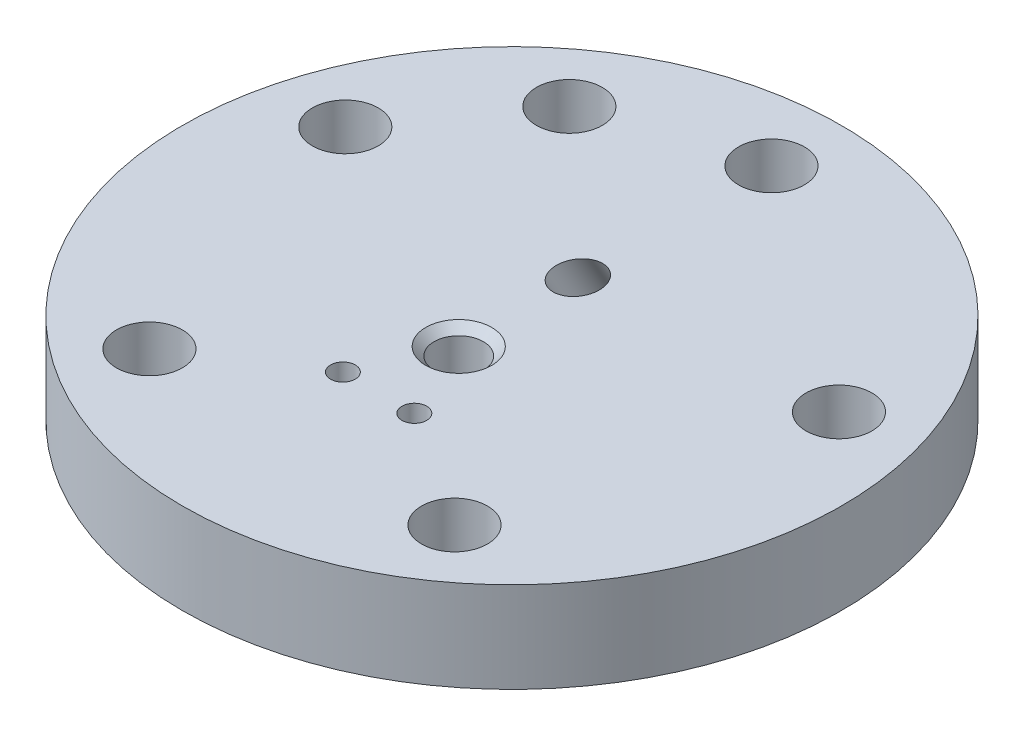
ISO-10303-21;
HEADER;
FILE_DESCRIPTION(('STEP AP214'),'2;1');
FILE_NAME('part.step','',(''),(''),'','','');
FILE_SCHEMA(('AUTOMOTIVE_DESIGN { 1 0 10303 214 1 1 1 1 }'));
ENDSEC;
DATA;
#1=APPLICATION_CONTEXT('core data for automotive mechanical design processes');
#2=APPLICATION_PROTOCOL_DEFINITION('international standard','automotive_design',2000,#1);
#3=PRODUCT_CONTEXT('',#1,'mechanical');
#4=PRODUCT('Part','Part','',(#3));
#5=PRODUCT_RELATED_PRODUCT_CATEGORY('part','',(#4));
#6=PRODUCT_DEFINITION_FORMATION('','',#4);
#7=PRODUCT_DEFINITION_CONTEXT('part definition',#1,'design');
#8=PRODUCT_DEFINITION('design','',#6,#7);
#9=PRODUCT_DEFINITION_SHAPE('','',#8);
#10=(LENGTH_UNIT() NAMED_UNIT(*) SI_UNIT(.MILLI.,.METRE.));
#11=(NAMED_UNIT(*) PLANE_ANGLE_UNIT() SI_UNIT($,.RADIAN.));
#12=(NAMED_UNIT(*) SI_UNIT($,.STERADIAN.) SOLID_ANGLE_UNIT());
#13=UNCERTAINTY_MEASURE_WITH_UNIT(LENGTH_MEASURE(1.E-05),#10,'distance_accuracy_value','');
#14=(GEOMETRIC_REPRESENTATION_CONTEXT(3) GLOBAL_UNCERTAINTY_ASSIGNED_CONTEXT((#13)) GLOBAL_UNIT_ASSIGNED_CONTEXT((#10,
#11,#12)) REPRESENTATION_CONTEXT('',''));
#15=CARTESIAN_POINT('',(0.,0.,0.));
#16=DIRECTION('',(0.,0.,1.));
#17=DIRECTION('',(1.,0.,0.));
#18=AXIS2_PLACEMENT_3D('',#15,#16,#17);
#19=CARTESIAN_POINT('',(0.,11.,0.));
#20=DIRECTION('',(0.,1.,0.));
#21=DIRECTION('',(0.,0.,1.));
#22=AXIS2_PLACEMENT_3D('',#19,#20,#21);
#23=PLANE('',#22);
#24=CARTESIAN_POINT('',(-4.33521900546723,11.,16.1792575903419));
#25=DIRECTION('',(0.,1.,0.));
#26=DIRECTION('',(0.,0.,1.));
#27=AXIS2_PLACEMENT_3D('',#24,#25,#26);
#28=CIRCLE('',#27,1.5);
#29=CARTESIAN_POINT('',(-4.33521900546723,11.,17.6792575903419));
#30=VERTEX_POINT('',#29);
#31=EDGE_CURVE('E128',#30,#30,#28,.T.);
#32=ORIENTED_EDGE('',*,*,#31,.F.);
#33=EDGE_LOOP('',(#32));
#34=FACE_BOUND('',#33,.T.);
#35=CARTESIAN_POINT('',(4.33521900546724,11.,16.1792575903419));
#36=DIRECTION('',(0.,1.,0.));
#37=DIRECTION('',(0.,0.,1.));
#38=AXIS2_PLACEMENT_3D('',#35,#36,#37);
#39=CIRCLE('',#38,1.5);
#40=CARTESIAN_POINT('',(4.33521900546724,11.,17.6792575903419));
#41=VERTEX_POINT('',#40);
#42=EDGE_CURVE('E120',#41,#41,#39,.T.);
#43=ORIENTED_EDGE('',*,*,#42,.F.);
#44=EDGE_LOOP('',(#43));
#45=FACE_BOUND('',#44,.T.);
#46=CARTESIAN_POINT('',(0.,11.,-8.));
#47=DIRECTION('',(0.,1.,0.));
#48=DIRECTION('',(0.,0.,1.));
#49=AXIS2_PLACEMENT_3D('',#46,#47,#48);
#50=ELLIPSE('',#49,3.00222139978605,2.6);
#51=CARTESIAN_POINT('',(0.,11.,-4.99777860021395));
#52=VERTEX_POINT('',#51);
#53=EDGE_CURVE('E116',#52,#52,#50,.T.);
#54=ORIENTED_EDGE('',*,*,#53,.F.);
#55=EDGE_LOOP('',(#54));
#56=FACE_BOUND('',#55,.T.);
#57=CARTESIAN_POINT('',(0.,11.,6.45602932216911));
#58=DIRECTION('',(0.,1.,0.));
#59=DIRECTION('',(0.,0.,1.));
#60=AXIS2_PLACEMENT_3D('',#57,#58,#59);
#61=CIRCLE('',#60,3.99999999999999);
#62=CARTESIAN_POINT('',(0.,11.,10.4560293221691));
#63=VERTEX_POINT('',#62);
#64=EDGE_CURVE('E10',#63,#63,#61,.F.);
#65=ORIENTED_EDGE('',*,*,#64,.T.);
#66=EDGE_LOOP('',(#65));
#67=FACE_BOUND('',#66,.T.);
#68=CARTESIAN_POINT('',(-18.5152354472113,11.,25.4840353228114));
#69=DIRECTION('',(0.,1.,0.));
#70=DIRECTION('',(0.,0.,1.));
#71=AXIS2_PLACEMENT_3D('',#68,#69,#70);
#72=CIRCLE('',#71,4.00000000000195);
#73=CARTESIAN_POINT('',(-18.5152354472113,11.,29.4840353228133));
#74=VERTEX_POINT('',#73);
#75=EDGE_CURVE('E93',#74,#74,#72,.T.);
#76=ORIENTED_EDGE('',*,*,#75,.F.);
#77=EDGE_LOOP('',(#76));
#78=FACE_BOUND('',#77,.T.);
#79=CARTESIAN_POINT('',(29.958280263298,11.,-9.73403532281169));
#80=DIRECTION('',(0.,1.,0.));
#81=DIRECTION('',(0.,0.,1.));
#82=AXIS2_PLACEMENT_3D('',#79,#80,#81);
#83=CIRCLE('',#82,4.00000000000043);
#84=CARTESIAN_POINT('',(29.958280263298,11.,-5.73403532281126));
#85=VERTEX_POINT('',#84);
#86=EDGE_CURVE('E77',#85,#85,#83,.T.);
#87=ORIENTED_EDGE('',*,*,#86,.F.);
#88=EDGE_LOOP('',(#87));
#89=FACE_BOUND('',#88,.T.);
#90=CARTESIAN_POINT('',(0.,11.,-31.5));
#91=DIRECTION('',(0.,1.,0.));
#92=DIRECTION('',(0.,0.,1.));
#93=AXIS2_PLACEMENT_3D('',#90,#91,#92);
#94=CIRCLE('',#93,4.);
#95=CARTESIAN_POINT('',(0.,11.,-27.5));
#96=VERTEX_POINT('',#95);
#97=EDGE_CURVE('E61',#96,#96,#94,.T.);
#98=ORIENTED_EDGE('',*,*,#97,.F.);
#99=EDGE_LOOP('',(#98));
#100=FACE_BOUND('',#99,.T.);
#101=CARTESIAN_POINT('',(0.,11.,0.));
#102=DIRECTION('',(0.,1.,0.));
#103=DIRECTION('',(0.,0.,1.));
#104=AXIS2_PLACEMENT_3D('',#101,#102,#103);
#105=CIRCLE('',#104,40.);
#106=CARTESIAN_POINT('',(0.,11.,40.));
#107=VERTEX_POINT('',#106);
#108=EDGE_CURVE('E54',#107,#107,#105,.T.);
#109=ORIENTED_EDGE('',*,*,#108,.T.);
#110=EDGE_LOOP('',(#109));
#111=FACE_BOUND('',#110,.T.);
#112=CARTESIAN_POINT('',(-18.5152354472129,11.,-25.4840353228109));
#113=DIRECTION('',(0.,1.,0.));
#114=DIRECTION('',(0.,0.,1.));
#115=AXIS2_PLACEMENT_3D('',#112,#113,#114);
#116=CIRCLE('',#115,4.);
#117=CARTESIAN_POINT('',(-18.5152354472129,11.,-21.4840353228109));
#118=VERTEX_POINT('',#117);
#119=EDGE_CURVE('E69',#118,#118,#116,.T.);
#120=ORIENTED_EDGE('',*,*,#119,.F.);
#121=EDGE_LOOP('',(#120));
#122=FACE_BOUND('',#121,.T.);
#123=CARTESIAN_POINT('',(18.5152354472145,11.,25.4840353228103));
#124=DIRECTION('',(0.,1.,0.));
#125=DIRECTION('',(0.,0.,1.));
#126=AXIS2_PLACEMENT_3D('',#123,#124,#125);
#127=CIRCLE('',#126,4.00000000000156);
#128=CARTESIAN_POINT('',(18.5152354472145,11.,29.4840353228119));
#129=VERTEX_POINT('',#128);
#130=EDGE_CURVE('E85',#129,#129,#127,.T.);
#131=ORIENTED_EDGE('',*,*,#130,.F.);
#132=EDGE_LOOP('',(#131));
#133=FACE_BOUND('',#132,.T.);
#134=CARTESIAN_POINT('',(-29.9582802632967,11.,-9.73403532280999));
#135=DIRECTION('',(0.,1.,0.));
#136=DIRECTION('',(0.,0.,1.));
#137=AXIS2_PLACEMENT_3D('',#134,#135,#136);
#138=CIRCLE('',#137,4.00000000000118);
#139=CARTESIAN_POINT('',(-29.9582802632967,11.,-5.73403532280881));
#140=VERTEX_POINT('',#139);
#141=EDGE_CURVE('E101',#140,#140,#138,.T.);
#142=ORIENTED_EDGE('',*,*,#141,.F.);
#143=EDGE_LOOP('',(#142));
#144=FACE_BOUND('',#143,.T.);
#145=ADVANCED_FACE('F39',(#34,#45,#56,#67,#78,#89,#100,#111,#122,#133,#144),#23,.T.);
#146=CARTESIAN_POINT('',(0.,0.,0.));
#147=DIRECTION('',(0.,1.,0.));
#148=DIRECTION('',(0.,0.,1.));
#149=AXIS2_PLACEMENT_3D('',#146,#147,#148);
#150=PLANE('',#149);
#151=CARTESIAN_POINT('',(0.,0.,-14.3508529610859));
#152=DIRECTION('',(0.,1.,0.));
#153=DIRECTION('',(0.,0.,1.));
#154=AXIS2_PLACEMENT_3D('',#151,#152,#153);
#155=ELLIPSE('',#154,3.00222139978605,2.6);
#156=CARTESIAN_POINT('',(0.,0.,-11.3486315612998));
#157=VERTEX_POINT('',#156);
#158=EDGE_CURVE('E44',#157,#157,#155,.T.);
#159=ORIENTED_EDGE('',*,*,#158,.T.);
#160=EDGE_LOOP('',(#159));
#161=FACE_BOUND('',#160,.T.);
#162=CARTESIAN_POINT('',(0.,0.,6.45602932216911));
#163=DIRECTION('',(0.,1.,0.));
#164=DIRECTION('',(0.,0.,1.));
#165=AXIS2_PLACEMENT_3D('',#162,#163,#164);
#166=CIRCLE('',#165,3.);
#167=CARTESIAN_POINT('',(0.,0.,9.45602932216911));
#168=VERTEX_POINT('',#167);
#169=EDGE_CURVE('E109',#168,#168,#166,.T.);
#170=ORIENTED_EDGE('',*,*,#169,.T.);
#171=EDGE_LOOP('',(#170));
#172=FACE_BOUND('',#171,.T.);
#173=CARTESIAN_POINT('',(0.,0.,0.));
#174=DIRECTION('',(0.,1.,0.));
#175=DIRECTION('',(0.,0.,1.));
#176=AXIS2_PLACEMENT_3D('',#173,#174,#175);
#177=CIRCLE('',#176,40.);
#178=CARTESIAN_POINT('',(0.,0.,40.));
#179=VERTEX_POINT('',#178);
#180=EDGE_CURVE('E57',#179,#179,#177,.T.);
#181=ORIENTED_EDGE('',*,*,#180,.F.);
#182=EDGE_LOOP('',(#181));
#183=FACE_BOUND('',#182,.T.);
#184=CARTESIAN_POINT('',(0.,0.,-31.5));
#185=DIRECTION('',(0.,1.,0.));
#186=DIRECTION('',(0.,0.,1.));
#187=AXIS2_PLACEMENT_3D('',#184,#185,#186);
#188=CIRCLE('',#187,4.);
#189=CARTESIAN_POINT('',(0.,0.,-27.5));
#190=VERTEX_POINT('',#189);
#191=EDGE_CURVE('E65',#190,#190,#188,.T.);
#192=ORIENTED_EDGE('',*,*,#191,.T.);
#193=EDGE_LOOP('',(#192));
#194=FACE_BOUND('',#193,.T.);
#195=CARTESIAN_POINT('',(-18.5152354472129,0.,-25.4840353228109));
#196=DIRECTION('',(0.,1.,0.));
#197=DIRECTION('',(0.,0.,1.));
#198=AXIS2_PLACEMENT_3D('',#195,#196,#197);
#199=CIRCLE('',#198,4.);
#200=CARTESIAN_POINT('',(-18.5152354472129,0.,-21.4840353228109));
#201=VERTEX_POINT('',#200);
#202=EDGE_CURVE('E73',#201,#201,#199,.T.);
#203=ORIENTED_EDGE('',*,*,#202,.T.);
#204=EDGE_LOOP('',(#203));
#205=FACE_BOUND('',#204,.T.);
#206=CARTESIAN_POINT('',(29.958280263298,0.,-9.73403532281169));
#207=DIRECTION('',(0.,1.,0.));
#208=DIRECTION('',(0.,0.,1.));
#209=AXIS2_PLACEMENT_3D('',#206,#207,#208);
#210=CIRCLE('',#209,4.00000000000043);
#211=CARTESIAN_POINT('',(29.958280263298,0.,-5.73403532281126));
#212=VERTEX_POINT('',#211);
#213=EDGE_CURVE('E81',#212,#212,#210,.T.);
#214=ORIENTED_EDGE('',*,*,#213,.T.);
#215=EDGE_LOOP('',(#214));
#216=FACE_BOUND('',#215,.T.);
#217=CARTESIAN_POINT('',(18.5152354472145,0.,25.4840353228103));
#218=DIRECTION('',(0.,1.,0.));
#219=DIRECTION('',(0.,0.,1.));
#220=AXIS2_PLACEMENT_3D('',#217,#218,#219);
#221=CIRCLE('',#220,4.00000000000156);
#222=CARTESIAN_POINT('',(18.5152354472145,0.,29.4840353228119));
#223=VERTEX_POINT('',#222);
#224=EDGE_CURVE('E89',#223,#223,#221,.T.);
#225=ORIENTED_EDGE('',*,*,#224,.T.);
#226=EDGE_LOOP('',(#225));
#227=FACE_BOUND('',#226,.T.);
#228=CARTESIAN_POINT('',(-18.5152354472113,0.,25.4840353228114));
#229=DIRECTION('',(0.,1.,0.));
#230=DIRECTION('',(0.,0.,1.));
#231=AXIS2_PLACEMENT_3D('',#228,#229,#230);
#232=CIRCLE('',#231,4.00000000000195);
#233=CARTESIAN_POINT('',(-18.5152354472113,0.,29.4840353228133));
#234=VERTEX_POINT('',#233);
#235=EDGE_CURVE('E97',#234,#234,#232,.T.);
#236=ORIENTED_EDGE('',*,*,#235,.T.);
#237=EDGE_LOOP('',(#236));
#238=FACE_BOUND('',#237,.T.);
#239=CARTESIAN_POINT('',(-29.9582802632967,0.,-9.73403532280999));
#240=DIRECTION('',(0.,1.,0.));
#241=DIRECTION('',(0.,0.,1.));
#242=AXIS2_PLACEMENT_3D('',#239,#240,#241);
#243=CIRCLE('',#242,4.00000000000118);
#244=CARTESIAN_POINT('',(-29.9582802632967,0.,-5.73403532280881));
#245=VERTEX_POINT('',#244);
#246=EDGE_CURVE('E105',#245,#245,#243,.T.);
#247=ORIENTED_EDGE('',*,*,#246,.T.);
#248=EDGE_LOOP('',(#247));
#249=FACE_BOUND('',#248,.T.);
#250=ADVANCED_FACE('F141',(#161,#172,#183,#194,#205,#216,#227,#238,#249),#150,.F.);
#251=CARTESIAN_POINT('',(0.,11.,0.));
#252=DIRECTION('',(0.,-1.,0.));
#253=DIRECTION('',(0.,0.,-1.));
#254=AXIS2_PLACEMENT_3D('',#251,#252,#253);
#255=CYLINDRICAL_SURFACE('',#254,40.);
#256=ORIENTED_EDGE('',*,*,#108,.F.);
#257=EDGE_LOOP('',(#256));
#258=FACE_BOUND('',#257,.T.);
#259=ORIENTED_EDGE('',*,*,#180,.T.);
#260=EDGE_LOOP('',(#259));
#261=FACE_BOUND('',#260,.T.);
#262=ADVANCED_FACE('F165',(#258,#261),#255,.T.);
#263=CARTESIAN_POINT('',(0.,11.,-31.5));
#264=DIRECTION('',(0.,-1.,0.));
#265=DIRECTION('',(0.,0.,-1.));
#266=AXIS2_PLACEMENT_3D('',#263,#264,#265);
#267=CYLINDRICAL_SURFACE('',#266,4.);
#268=ORIENTED_EDGE('',*,*,#97,.T.);
#269=EDGE_LOOP('',(#268));
#270=FACE_BOUND('',#269,.T.);
#271=ORIENTED_EDGE('',*,*,#191,.F.);
#272=EDGE_LOOP('',(#271));
#273=FACE_BOUND('',#272,.T.);
#274=ADVANCED_FACE('F170',(#270,#273),#267,.F.);
#275=CARTESIAN_POINT('',(-18.5152354472129,11.,-25.4840353228109));
#276=DIRECTION('',(0.,-1.,0.));
#277=DIRECTION('',(0.,0.,-1.));
#278=AXIS2_PLACEMENT_3D('',#275,#276,#277);
#279=CYLINDRICAL_SURFACE('',#278,4.);
#280=ORIENTED_EDGE('',*,*,#119,.T.);
#281=EDGE_LOOP('',(#280));
#282=FACE_BOUND('',#281,.T.);
#283=ORIENTED_EDGE('',*,*,#202,.F.);
#284=EDGE_LOOP('',(#283));
#285=FACE_BOUND('',#284,.T.);
#286=ADVANCED_FACE('F177',(#282,#285),#279,.F.);
#287=CARTESIAN_POINT('',(29.958280263298,11.,-9.73403532281169));
#288=DIRECTION('',(0.,-1.,0.));
#289=DIRECTION('',(0.,0.,-1.));
#290=AXIS2_PLACEMENT_3D('',#287,#288,#289);
#291=CYLINDRICAL_SURFACE('',#290,4.00000000000043);
#292=ORIENTED_EDGE('',*,*,#86,.T.);
#293=EDGE_LOOP('',(#292));
#294=FACE_BOUND('',#293,.T.);
#295=ORIENTED_EDGE('',*,*,#213,.F.);
#296=EDGE_LOOP('',(#295));
#297=FACE_BOUND('',#296,.T.);
#298=ADVANCED_FACE('F212',(#294,#297),#291,.F.);
#299=CARTESIAN_POINT('',(18.5152354472145,11.,25.4840353228103));
#300=DIRECTION('',(0.,-1.,0.));
#301=DIRECTION('',(0.,0.,-1.));
#302=AXIS2_PLACEMENT_3D('',#299,#300,#301);
#303=CYLINDRICAL_SURFACE('',#302,4.00000000000156);
#304=ORIENTED_EDGE('',*,*,#130,.T.);
#305=EDGE_LOOP('',(#304));
#306=FACE_BOUND('',#305,.T.);
#307=ORIENTED_EDGE('',*,*,#224,.F.);
#308=EDGE_LOOP('',(#307));
#309=FACE_BOUND('',#308,.T.);
#310=ADVANCED_FACE('F206',(#306,#309),#303,.F.);
#311=CARTESIAN_POINT('',(-18.5152354472113,11.,25.4840353228114));
#312=DIRECTION('',(0.,-1.,0.));
#313=DIRECTION('',(0.,0.,-1.));
#314=AXIS2_PLACEMENT_3D('',#311,#312,#313);
#315=CYLINDRICAL_SURFACE('',#314,4.00000000000195);
#316=ORIENTED_EDGE('',*,*,#75,.T.);
#317=EDGE_LOOP('',(#316));
#318=FACE_BOUND('',#317,.T.);
#319=ORIENTED_EDGE('',*,*,#235,.F.);
#320=EDGE_LOOP('',(#319));
#321=FACE_BOUND('',#320,.T.);
#322=ADVANCED_FACE('F198',(#318,#321),#315,.F.);
#323=CARTESIAN_POINT('',(-29.9582802632967,11.,-9.73403532280999));
#324=DIRECTION('',(0.,-1.,0.));
#325=DIRECTION('',(0.,0.,-1.));
#326=AXIS2_PLACEMENT_3D('',#323,#324,#325);
#327=CYLINDRICAL_SURFACE('',#326,4.00000000000118);
#328=ORIENTED_EDGE('',*,*,#141,.T.);
#329=EDGE_LOOP('',(#328));
#330=FACE_BOUND('',#329,.T.);
#331=ORIENTED_EDGE('',*,*,#246,.F.);
#332=EDGE_LOOP('',(#331));
#333=FACE_BOUND('',#332,.T.);
#334=ADVANCED_FACE('F196',(#330,#333),#327,.F.);
#335=CARTESIAN_POINT('',(0.,0.,6.45602932216911));
#336=DIRECTION('',(0.,1.,0.));
#337=DIRECTION('',(0.,0.,1.));
#338=AXIS2_PLACEMENT_3D('',#335,#336,#337);
#339=CYLINDRICAL_SURFACE('',#338,3.);
#340=CARTESIAN_POINT('',(0.,10.,6.45602932216911));
#341=DIRECTION('',(0.,1.,0.));
#342=DIRECTION('',(0.,0.,1.));
#343=AXIS2_PLACEMENT_3D('',#340,#341,#342);
#344=CIRCLE('',#343,3.);
#345=CARTESIAN_POINT('',(0.,10.,9.45602932216911));
#346=VERTEX_POINT('',#345);
#347=EDGE_CURVE('E49',#346,#346,#344,.T.);
#348=ORIENTED_EDGE('',*,*,#347,.T.);
#349=EDGE_LOOP('',(#348));
#350=FACE_BOUND('',#349,.T.);
#351=ORIENTED_EDGE('',*,*,#169,.F.);
#352=EDGE_LOOP('',(#351));
#353=FACE_BOUND('',#352,.T.);
#354=ADVANCED_FACE('F156',(#350,#353),#339,.F.);
#355=CARTESIAN_POINT('',(0.,10.,6.45602932216911));
#356=DIRECTION('',(0.,1.,0.));
#357=DIRECTION('',(0.,0.,1.));
#358=AXIS2_PLACEMENT_3D('',#355,#356,#357);
#359=CONICAL_SURFACE('',#358,3.,0.78539816339745);
#360=ORIENTED_EDGE('',*,*,#64,.F.);
#361=EDGE_LOOP('',(#360));
#362=FACE_BOUND('',#361,.T.);
#363=ORIENTED_EDGE('',*,*,#347,.F.);
#364=EDGE_LOOP('',(#363));
#365=FACE_BOUND('',#364,.T.);
#366=ADVANCED_FACE('F42',(#362,#365),#359,.F.);
#367=CARTESIAN_POINT('',(0.,-2.44615242270668,-15.7631397208144));
#368=DIRECTION('',(0.,0.86602540378444,0.499999999999998));
#369=DIRECTION('',(0.,-0.499999999999998,0.86602540378444));
#370=AXIS2_PLACEMENT_3D('',#367,#368,#369);
#371=CYLINDRICAL_SURFACE('',#370,2.6);
#372=ORIENTED_EDGE('',*,*,#53,.T.);
#373=EDGE_LOOP('',(#372));
#374=FACE_BOUND('',#373,.T.);
#375=ORIENTED_EDGE('',*,*,#158,.F.);
#376=EDGE_LOOP('',(#375));
#377=FACE_BOUND('',#376,.T.);
#378=ADVANCED_FACE('F144',(#374,#377),#371,.F.);
#379=CARTESIAN_POINT('',(4.33521900546724,3.,16.1792575903419));
#380=DIRECTION('',(0.,1.,0.));
#381=DIRECTION('',(0.,0.,1.));
#382=AXIS2_PLACEMENT_3D('',#379,#380,#381);
#383=CYLINDRICAL_SURFACE('',#382,1.5);
#384=CARTESIAN_POINT('',(4.33521900546724,3.,16.1792575903419));
#385=DIRECTION('',(0.,1.,0.));
#386=DIRECTION('',(0.,0.,1.));
#387=AXIS2_PLACEMENT_3D('',#384,#385,#386);
#388=CIRCLE('',#387,1.5);
#389=CARTESIAN_POINT('',(4.33521900546724,3.,17.6792575903419));
#390=VERTEX_POINT('',#389);
#391=EDGE_CURVE('E124',#390,#390,#388,.T.);
#392=ORIENTED_EDGE('',*,*,#391,.F.);
#393=EDGE_LOOP('',(#392));
#394=FACE_BOUND('',#393,.T.);
#395=ORIENTED_EDGE('',*,*,#42,.T.);
#396=EDGE_LOOP('',(#395));
#397=FACE_BOUND('',#396,.T.);
#398=ADVANCED_FACE('F146',(#394,#397),#383,.F.);
#399=CARTESIAN_POINT('',(4.33521900546724,3.,16.1792575903419));
#400=DIRECTION('',(0.,1.,0.));
#401=DIRECTION('',(0.,0.,1.));
#402=AXIS2_PLACEMENT_3D('',#399,#400,#401);
#403=PLANE('',#402);
#404=ORIENTED_EDGE('',*,*,#391,.T.);
#405=EDGE_LOOP('',(#404));
#406=FACE_BOUND('',#405,.T.);
#407=ADVANCED_FACE('F153',(#406),#403,.T.);
#408=CARTESIAN_POINT('',(-4.33521900546723,3.,16.1792575903419));
#409=DIRECTION('',(0.,1.,0.));
#410=DIRECTION('',(0.,0.,1.));
#411=AXIS2_PLACEMENT_3D('',#408,#409,#410);
#412=CYLINDRICAL_SURFACE('',#411,1.5);
#413=CARTESIAN_POINT('',(-4.33521900546723,3.,16.1792575903419));
#414=DIRECTION('',(0.,1.,0.));
#415=DIRECTION('',(0.,0.,1.));
#416=AXIS2_PLACEMENT_3D('',#413,#414,#415);
#417=CIRCLE('',#416,1.5);
#418=CARTESIAN_POINT('',(-4.33521900546723,3.,17.6792575903419));
#419=VERTEX_POINT('',#418);
#420=EDGE_CURVE('E132',#419,#419,#417,.T.);
#421=ORIENTED_EDGE('',*,*,#420,.F.);
#422=EDGE_LOOP('',(#421));
#423=FACE_BOUND('',#422,.T.);
#424=ORIENTED_EDGE('',*,*,#31,.T.);
#425=EDGE_LOOP('',(#424));
#426=FACE_BOUND('',#425,.T.);
#427=ADVANCED_FACE('F288',(#423,#426),#412,.F.);
#428=CARTESIAN_POINT('',(-4.33521900546723,3.,16.1792575903419));
#429=DIRECTION('',(0.,1.,0.));
#430=DIRECTION('',(0.,0.,1.));
#431=AXIS2_PLACEMENT_3D('',#428,#429,#430);
#432=PLANE('',#431);
#433=ORIENTED_EDGE('',*,*,#420,.T.);
#434=EDGE_LOOP('',(#433));
#435=FACE_BOUND('',#434,.T.);
#436=ADVANCED_FACE('F298',(#435),#432,.T.);
#437=CLOSED_SHELL('',(#145,#250,#262,#274,#286,#298,#310,#322,#334,#354,#366,#378,#398,#407,
#427,#436));
#438=MANIFOLD_SOLID_BREP('B2',#437);
#439=ADVANCED_BREP_SHAPE_REPRESENTATION('',(#18,#438),#14);
#440=SHAPE_DEFINITION_REPRESENTATION(#9,#439);
ENDSEC;
END-ISO-10303-21;
